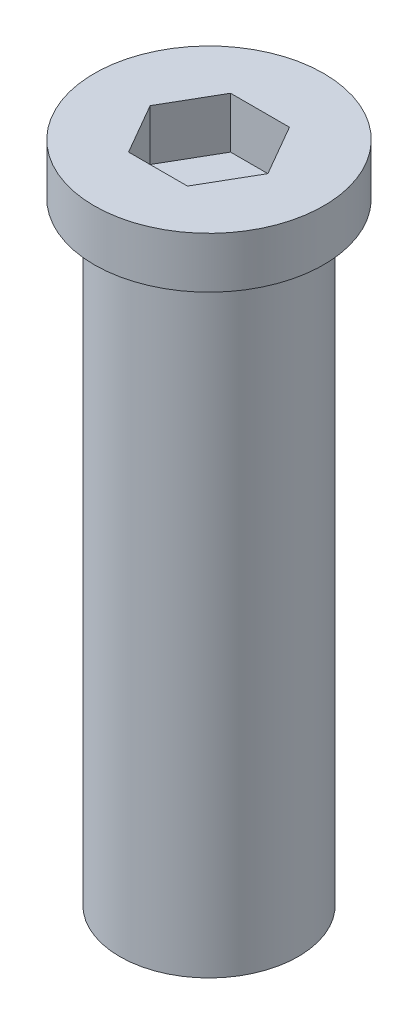
ISO-10303-21;
HEADER;
FILE_DESCRIPTION(('STEP AP214'),'2;1');
FILE_NAME('part.step','',(''),(''),'','','');
FILE_SCHEMA(('AUTOMOTIVE_DESIGN { 1 0 10303 214 1 1 1 1 }'));
ENDSEC;
DATA;
#1=APPLICATION_CONTEXT('core data for automotive mechanical design processes');
#2=APPLICATION_PROTOCOL_DEFINITION('international standard','automotive_design',2000,#1);
#3=PRODUCT_CONTEXT('',#1,'mechanical');
#4=PRODUCT('Part','Part','',(#3));
#5=PRODUCT_RELATED_PRODUCT_CATEGORY('part','',(#4));
#6=PRODUCT_DEFINITION_FORMATION('','',#4);
#7=PRODUCT_DEFINITION_CONTEXT('part definition',#1,'design');
#8=PRODUCT_DEFINITION('design','',#6,#7);
#9=PRODUCT_DEFINITION_SHAPE('','',#8);
#10=(LENGTH_UNIT() NAMED_UNIT(*) SI_UNIT(.MILLI.,.METRE.));
#11=(NAMED_UNIT(*) PLANE_ANGLE_UNIT() SI_UNIT($,.RADIAN.));
#12=(NAMED_UNIT(*) SI_UNIT($,.STERADIAN.) SOLID_ANGLE_UNIT());
#13=UNCERTAINTY_MEASURE_WITH_UNIT(LENGTH_MEASURE(1.E-05),#10,'distance_accuracy_value','');
#14=(GEOMETRIC_REPRESENTATION_CONTEXT(3) GLOBAL_UNCERTAINTY_ASSIGNED_CONTEXT((#13)) GLOBAL_UNIT_ASSIGNED_CONTEXT((#10,
#11,#12)) REPRESENTATION_CONTEXT('',''));
#15=CARTESIAN_POINT('',(0.,0.,0.));
#16=DIRECTION('',(0.,0.,1.));
#17=DIRECTION('',(1.,0.,0.));
#18=AXIS2_PLACEMENT_3D('',#15,#16,#17);
#19=CARTESIAN_POINT('',(0.,7.,0.));
#20=DIRECTION('',(0.,1.,0.));
#21=DIRECTION('',(0.,0.,1.));
#22=AXIS2_PLACEMENT_3D('',#19,#20,#21);
#23=PLANE('',#22);
#24=CARTESIAN_POINT('',(0.,7.,0.));
#25=DIRECTION('',(0.,1.,0.));
#26=DIRECTION('',(0.,0.,1.));
#27=AXIS2_PLACEMENT_3D('',#24,#25,#26);
#28=CIRCLE('',#27,2.25);
#29=CARTESIAN_POINT('',(0.,7.,2.25));
#30=VERTEX_POINT('',#29);
#31=EDGE_CURVE('E147',#30,#30,#28,.T.);
#32=ORIENTED_EDGE('',*,*,#31,.T.);
#33=EDGE_LOOP('',(#32));
#34=FACE_BOUND('',#33,.T.);
#35=DIRECTION('',(0.499999998947293,0.,-0.866025404392219));
#36=VECTOR('',#35,1.);
#37=CARTESIAN_POINT('',(0.577350268784439,7.,1.00000000631624));
#38=LINE('',#37,#36);
#39=CARTESIAN_POINT('',(0.577350268784439,7.,1.00000000631624));
#40=VERTEX_POINT('',#39);
#41=CARTESIAN_POINT('',(1.15470053756888,7.,4.21082841382188E-09));
#42=VERTEX_POINT('',#41);
#43=EDGE_CURVE('E136',#40,#42,#38,.T.);
#44=ORIENTED_EDGE('',*,*,#43,.F.);
#45=DIRECTION('',(-1.,0.,-3.64668446198826E-09));
#46=VECTOR('',#45,1.);
#47=CARTESIAN_POINT('',(0.577350268784439,7.,1.00000000631624));
#48=LINE('',#47,#46);
#49=CARTESIAN_POINT('',(-0.577350271215561,7.,1.00000000210541));
#50=VERTEX_POINT('',#49);
#51=EDGE_CURVE('E56',#40,#50,#48,.T.);
#52=ORIENTED_EDGE('',*,*,#51,.T.);
#53=DIRECTION('',(-0.499999998947293,0.,-0.866025404392219));
#54=VECTOR('',#53,1.);
#55=CARTESIAN_POINT('',(-0.577350271215561,7.,1.00000000210541));
#56=LINE('',#55,#54);
#57=CARTESIAN_POINT('',(-1.15470054,7.,0.));
#58=VERTEX_POINT('',#57);
#59=EDGE_CURVE('E127',#50,#58,#56,.T.);
#60=ORIENTED_EDGE('',*,*,#59,.T.);
#61=DIRECTION('',(-0.500000002105414,0.,0.866025402568877));
#62=VECTOR('',#61,1.);
#63=CARTESIAN_POINT('',(-0.577350267568877,7.,-1.));
#64=LINE('',#63,#62);
#65=CARTESIAN_POINT('',(-0.577350267568877,7.,-1.));
#66=VERTEX_POINT('',#65);
#67=EDGE_CURVE('E130',#66,#58,#64,.T.);
#68=ORIENTED_EDGE('',*,*,#67,.F.);
#69=DIRECTION('',(-1.,0.,0.));
#70=VECTOR('',#69,1.);
#71=CARTESIAN_POINT('',(0.577350272431123,7.,-1.));
#72=LINE('',#71,#70);
#73=CARTESIAN_POINT('',(0.577350272431123,7.,-1.));
#74=VERTEX_POINT('',#73);
#75=EDGE_CURVE('E133',#74,#66,#72,.T.);
#76=ORIENTED_EDGE('',*,*,#75,.F.);
#77=DIRECTION('',(0.499999995789172,0.,0.866025406215562));
#78=VECTOR('',#77,1.);
#79=CARTESIAN_POINT('',(0.577350272431123,7.,-1.));
#80=LINE('',#79,#78);
#81=EDGE_CURVE('E104',#74,#42,#80,.T.);
#82=ORIENTED_EDGE('',*,*,#81,.T.);
#83=EDGE_LOOP('',(#44,#52,#60,#68,#76,#82));
#84=FACE_BOUND('',#83,.T.);
#85=ADVANCED_FACE('F41',(#34,#84),#23,.T.);
#86=CARTESIAN_POINT('',(0.,6.,0.));
#87=DIRECTION('',(0.,-1.,0.));
#88=DIRECTION('',(0.,0.,-1.));
#89=AXIS2_PLACEMENT_3D('',#86,#87,#88);
#90=CYLINDRICAL_SURFACE('',#89,1.75);
#91=CARTESIAN_POINT('',(0.,6.,0.));
#92=DIRECTION('',(0.,1.,0.));
#93=DIRECTION('',(0.,0.,1.));
#94=AXIS2_PLACEMENT_3D('',#91,#92,#93);
#95=CIRCLE('',#94,1.75);
#96=CARTESIAN_POINT('',(0.,6.,1.75));
#97=VERTEX_POINT('',#96);
#98=EDGE_CURVE('E11',#97,#97,#95,.T.);
#99=ORIENTED_EDGE('',*,*,#98,.F.);
#100=EDGE_LOOP('',(#99));
#101=FACE_BOUND('',#100,.T.);
#102=CARTESIAN_POINT('',(0.,-6.,0.));
#103=DIRECTION('',(0.,1.,0.));
#104=DIRECTION('',(0.,0.,1.));
#105=AXIS2_PLACEMENT_3D('',#102,#103,#104);
#106=CIRCLE('',#105,1.75);
#107=CARTESIAN_POINT('',(0.,-6.,1.75));
#108=VERTEX_POINT('',#107);
#109=EDGE_CURVE('E45',#108,#108,#106,.T.);
#110=ORIENTED_EDGE('',*,*,#109,.T.);
#111=EDGE_LOOP('',(#110));
#112=FACE_BOUND('',#111,.T.);
#113=ADVANCED_FACE('F43',(#101,#112),#90,.T.);
#114=CARTESIAN_POINT('',(0.,-6.,0.));
#115=DIRECTION('',(0.,1.,0.));
#116=DIRECTION('',(0.,0.,1.));
#117=AXIS2_PLACEMENT_3D('',#114,#115,#116);
#118=PLANE('',#117);
#119=ORIENTED_EDGE('',*,*,#109,.F.);
#120=EDGE_LOOP('',(#119));
#121=FACE_BOUND('',#120,.T.);
#122=ADVANCED_FACE('F167',(#121),#118,.F.);
#123=CARTESIAN_POINT('',(0.,7.,0.));
#124=DIRECTION('',(0.,-1.,0.));
#125=DIRECTION('',(0.,0.,-1.));
#126=AXIS2_PLACEMENT_3D('',#123,#124,#125);
#127=CYLINDRICAL_SURFACE('',#126,2.25);
#128=ORIENTED_EDGE('',*,*,#31,.F.);
#129=EDGE_LOOP('',(#128));
#130=FACE_BOUND('',#129,.T.);
#131=CARTESIAN_POINT('',(0.,6.,0.));
#132=DIRECTION('',(0.,1.,0.));
#133=DIRECTION('',(0.,0.,1.));
#134=AXIS2_PLACEMENT_3D('',#131,#132,#133);
#135=CIRCLE('',#134,2.25);
#136=CARTESIAN_POINT('',(0.,6.,2.25));
#137=VERTEX_POINT('',#136);
#138=EDGE_CURVE('E146',#137,#137,#135,.T.);
#139=ORIENTED_EDGE('',*,*,#138,.T.);
#140=EDGE_LOOP('',(#139));
#141=FACE_BOUND('',#140,.T.);
#142=ADVANCED_FACE('F153',(#130,#141),#127,.T.);
#143=CARTESIAN_POINT('',(0.,6.,0.));
#144=DIRECTION('',(0.,1.,0.));
#145=DIRECTION('',(0.,0.,1.));
#146=AXIS2_PLACEMENT_3D('',#143,#144,#145);
#147=PLANE('',#146);
#148=ORIENTED_EDGE('',*,*,#98,.T.);
#149=EDGE_LOOP('',(#148));
#150=FACE_BOUND('',#149,.T.);
#151=ORIENTED_EDGE('',*,*,#138,.F.);
#152=EDGE_LOOP('',(#151));
#153=FACE_BOUND('',#152,.T.);
#154=ADVANCED_FACE('F155',(#150,#153),#147,.F.);
#155=CARTESIAN_POINT('',(0.577350268784439,6.,1.00000000631624));
#156=DIRECTION('',(3.64668446198826E-09,0.,-1.));
#157=DIRECTION('',(-1.,0.,-3.64668446198826E-09));
#158=AXIS2_PLACEMENT_3D('',#155,#156,#157);
#159=PLANE('',#158);
#160=ORIENTED_EDGE('',*,*,#51,.F.);
#161=DIRECTION('',(0.,1.,0.));
#162=VECTOR('',#161,1.);
#163=CARTESIAN_POINT('',(0.577350268784439,6.,1.00000000631624));
#164=LINE('',#163,#162);
#165=CARTESIAN_POINT('',(0.577350268784439,6.,1.00000000631624));
#166=VERTEX_POINT('',#165);
#167=EDGE_CURVE('E61',#166,#40,#164,.T.);
#168=ORIENTED_EDGE('',*,*,#167,.F.);
#169=DIRECTION('',(-1.,0.,-3.64668446198826E-09));
#170=VECTOR('',#169,1.);
#171=CARTESIAN_POINT('',(0.577350268784439,6.,1.00000000631624));
#172=LINE('',#171,#170);
#173=CARTESIAN_POINT('',(-0.577350271215561,6.,1.00000000210541));
#174=VERTEX_POINT('',#173);
#175=EDGE_CURVE('E138',#166,#174,#172,.T.);
#176=ORIENTED_EDGE('',*,*,#175,.T.);
#177=DIRECTION('',(0.,1.,0.));
#178=VECTOR('',#177,1.);
#179=CARTESIAN_POINT('',(-0.577350271215561,6.,1.00000000210541));
#180=LINE('',#179,#178);
#181=EDGE_CURVE('E144',#174,#50,#180,.T.);
#182=ORIENTED_EDGE('',*,*,#181,.T.);
#183=EDGE_LOOP('',(#160,#168,#176,#182));
#184=FACE_BOUND('',#183,.T.);
#185=ADVANCED_FACE('F157',(#184),#159,.T.);
#186=CARTESIAN_POINT('',(-0.577350271215561,6.,1.00000000210541));
#187=DIRECTION('',(0.866025404392219,0.,-0.499999998947293));
#188=DIRECTION('',(-0.499999998947293,0.,-0.866025404392219));
#189=AXIS2_PLACEMENT_3D('',#186,#187,#188);
#190=PLANE('',#189);
#191=ORIENTED_EDGE('',*,*,#59,.F.);
#192=ORIENTED_EDGE('',*,*,#181,.F.);
#193=DIRECTION('',(-0.499999998947293,0.,-0.866025404392219));
#194=VECTOR('',#193,1.);
#195=CARTESIAN_POINT('',(-0.577350271215561,6.,1.00000000210541));
#196=LINE('',#195,#194);
#197=CARTESIAN_POINT('',(-1.15470054,6.,0.));
#198=VERTEX_POINT('',#197);
#199=EDGE_CURVE('E93',#174,#198,#196,.T.);
#200=ORIENTED_EDGE('',*,*,#199,.T.);
#201=DIRECTION('',(0.,1.,0.));
#202=VECTOR('',#201,1.);
#203=CARTESIAN_POINT('',(-1.15470054,6.,0.));
#204=LINE('',#203,#202);
#205=EDGE_CURVE('E142',#198,#58,#204,.T.);
#206=ORIENTED_EDGE('',*,*,#205,.T.);
#207=EDGE_LOOP('',(#191,#192,#200,#206));
#208=FACE_BOUND('',#207,.T.);
#209=ADVANCED_FACE('F165',(#208),#190,.T.);
#210=CARTESIAN_POINT('',(-0.577350267568877,6.,-1.));
#211=DIRECTION('',(-0.866025402568877,0.,-0.500000002105414));
#212=DIRECTION('',(-0.500000002105414,0.,0.866025402568877));
#213=AXIS2_PLACEMENT_3D('',#210,#211,#212);
#214=PLANE('',#213);
#215=ORIENTED_EDGE('',*,*,#67,.T.);
#216=ORIENTED_EDGE('',*,*,#205,.F.);
#217=DIRECTION('',(-0.500000002105414,0.,0.866025402568877));
#218=VECTOR('',#217,1.);
#219=CARTESIAN_POINT('',(-0.577350267568877,6.,-1.));
#220=LINE('',#219,#218);
#221=CARTESIAN_POINT('',(-0.577350267568877,6.,-1.));
#222=VERTEX_POINT('',#221);
#223=EDGE_CURVE('E120',#222,#198,#220,.T.);
#224=ORIENTED_EDGE('',*,*,#223,.F.);
#225=DIRECTION('',(0.,1.,0.));
#226=VECTOR('',#225,1.);
#227=CARTESIAN_POINT('',(-0.577350267568877,6.,-1.));
#228=LINE('',#227,#226);
#229=EDGE_CURVE('E109',#222,#66,#228,.T.);
#230=ORIENTED_EDGE('',*,*,#229,.T.);
#231=EDGE_LOOP('',(#215,#216,#224,#230));
#232=FACE_BOUND('',#231,.T.);
#233=ADVANCED_FACE('F180',(#232),#214,.F.);
#234=CARTESIAN_POINT('',(0.577350272431123,6.,-1.));
#235=DIRECTION('',(0.,0.,-1.));
#236=DIRECTION('',(-1.,0.,0.));
#237=AXIS2_PLACEMENT_3D('',#234,#235,#236);
#238=PLANE('',#237);
#239=ORIENTED_EDGE('',*,*,#75,.T.);
#240=ORIENTED_EDGE('',*,*,#229,.F.);
#241=DIRECTION('',(-1.,0.,0.));
#242=VECTOR('',#241,1.);
#243=CARTESIAN_POINT('',(0.577350272431123,6.,-1.));
#244=LINE('',#243,#242);
#245=CARTESIAN_POINT('',(0.577350272431123,6.,-1.));
#246=VERTEX_POINT('',#245);
#247=EDGE_CURVE('E114',#246,#222,#244,.T.);
#248=ORIENTED_EDGE('',*,*,#247,.F.);
#249=DIRECTION('',(0.,1.,0.));
#250=VECTOR('',#249,1.);
#251=CARTESIAN_POINT('',(0.577350272431123,6.,-1.));
#252=LINE('',#251,#250);
#253=EDGE_CURVE('E99',#246,#74,#252,.T.);
#254=ORIENTED_EDGE('',*,*,#253,.T.);
#255=EDGE_LOOP('',(#239,#240,#248,#254));
#256=FACE_BOUND('',#255,.T.);
#257=ADVANCED_FACE('F118',(#256),#238,.F.);
#258=CARTESIAN_POINT('',(0.577350272431123,6.,-1.));
#259=DIRECTION('',(-0.866025406215562,0.,0.499999995789171));
#260=DIRECTION('',(0.499999995789171,0.,0.866025406215562));
#261=AXIS2_PLACEMENT_3D('',#258,#259,#260);
#262=PLANE('',#261);
#263=ORIENTED_EDGE('',*,*,#81,.F.);
#264=ORIENTED_EDGE('',*,*,#253,.F.);
#265=DIRECTION('',(0.499999995789172,0.,0.866025406215562));
#266=VECTOR('',#265,1.);
#267=CARTESIAN_POINT('',(0.577350272431123,6.,-1.));
#268=LINE('',#267,#266);
#269=CARTESIAN_POINT('',(1.15470053756888,6.,4.21082841382188E-09));
#270=VERTEX_POINT('',#269);
#271=EDGE_CURVE('E102',#246,#270,#268,.T.);
#272=ORIENTED_EDGE('',*,*,#271,.T.);
#273=DIRECTION('',(0.,1.,0.));
#274=VECTOR('',#273,1.);
#275=CARTESIAN_POINT('',(1.15470053756888,6.,4.21082841382188E-09));
#276=LINE('',#275,#274);
#277=EDGE_CURVE('E85',#270,#42,#276,.T.);
#278=ORIENTED_EDGE('',*,*,#277,.T.);
#279=EDGE_LOOP('',(#263,#264,#272,#278));
#280=FACE_BOUND('',#279,.T.);
#281=ADVANCED_FACE('F101',(#280),#262,.T.);
#282=CARTESIAN_POINT('',(0.577350268784439,6.,1.00000000631624));
#283=DIRECTION('',(0.866025404392219,0.,0.499999998947293));
#284=DIRECTION('',(0.499999998947293,0.,-0.866025404392219));
#285=AXIS2_PLACEMENT_3D('',#282,#283,#284);
#286=PLANE('',#285);
#287=ORIENTED_EDGE('',*,*,#43,.T.);
#288=ORIENTED_EDGE('',*,*,#277,.F.);
#289=DIRECTION('',(0.499999998947293,0.,-0.866025404392219));
#290=VECTOR('',#289,1.);
#291=CARTESIAN_POINT('',(0.577350268784439,6.,1.00000000631624));
#292=LINE('',#291,#290);
#293=EDGE_CURVE('E116',#166,#270,#292,.T.);
#294=ORIENTED_EDGE('',*,*,#293,.F.);
#295=ORIENTED_EDGE('',*,*,#167,.T.);
#296=EDGE_LOOP('',(#287,#288,#294,#295));
#297=FACE_BOUND('',#296,.T.);
#298=ADVANCED_FACE('F189',(#297),#286,.F.);
#299=CARTESIAN_POINT('',(0.,6.,0.));
#300=DIRECTION('',(0.,-1.,0.));
#301=DIRECTION('',(0.,0.,-1.));
#302=AXIS2_PLACEMENT_3D('',#299,#300,#301);
#303=PLANE('',#302);
#304=ORIENTED_EDGE('',*,*,#175,.F.);
#305=ORIENTED_EDGE('',*,*,#293,.T.);
#306=ORIENTED_EDGE('',*,*,#271,.F.);
#307=ORIENTED_EDGE('',*,*,#247,.T.);
#308=ORIENTED_EDGE('',*,*,#223,.T.);
#309=ORIENTED_EDGE('',*,*,#199,.F.);
#310=EDGE_LOOP('',(#304,#305,#306,#307,#308,#309));
#311=FACE_BOUND('',#310,.T.);
#312=ADVANCED_FACE('F113',(#311),#303,.F.);
#313=CLOSED_SHELL('',(#85,#113,#122,#142,#154,#185,#209,#233,#257,#281,#298,#312));
#314=MANIFOLD_SOLID_BREP('B2',#313);
#315=ADVANCED_BREP_SHAPE_REPRESENTATION('',(#18,#314),#14);
#316=SHAPE_DEFINITION_REPRESENTATION(#9,#315);
ENDSEC;
END-ISO-10303-21;
